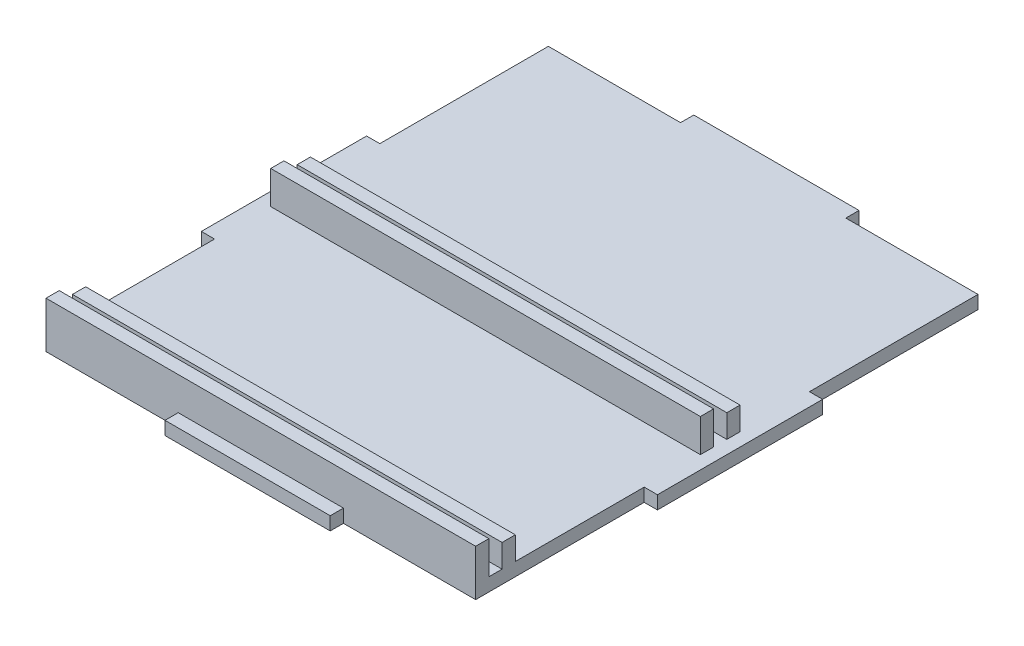
ISO-10303-21;
HEADER;
FILE_DESCRIPTION(('STEP AP214'),'2;1');
FILE_NAME('part.step','',(''),(''),'','','');
FILE_SCHEMA(('AUTOMOTIVE_DESIGN { 1 0 10303 214 1 1 1 1 }'));
ENDSEC;
DATA;
#1=APPLICATION_CONTEXT('core data for automotive mechanical design processes');
#2=APPLICATION_PROTOCOL_DEFINITION('international standard','automotive_design',2000,#1);
#3=PRODUCT_CONTEXT('',#1,'mechanical');
#4=PRODUCT('Part','Part','',(#3));
#5=PRODUCT_RELATED_PRODUCT_CATEGORY('part','',(#4));
#6=PRODUCT_DEFINITION_FORMATION('','',#4);
#7=PRODUCT_DEFINITION_CONTEXT('part definition',#1,'design');
#8=PRODUCT_DEFINITION('design','',#6,#7);
#9=PRODUCT_DEFINITION_SHAPE('','',#8);
#10=(LENGTH_UNIT() NAMED_UNIT(*) SI_UNIT(.MILLI.,.METRE.));
#11=(NAMED_UNIT(*) PLANE_ANGLE_UNIT() SI_UNIT($,.RADIAN.));
#12=(NAMED_UNIT(*) SI_UNIT($,.STERADIAN.) SOLID_ANGLE_UNIT());
#13=UNCERTAINTY_MEASURE_WITH_UNIT(LENGTH_MEASURE(1.E-05),#10,'distance_accuracy_value','');
#14=(GEOMETRIC_REPRESENTATION_CONTEXT(3) GLOBAL_UNCERTAINTY_ASSIGNED_CONTEXT((#13)) GLOBAL_UNIT_ASSIGNED_CONTEXT((#10,
#11,#12)) REPRESENTATION_CONTEXT('',''));
#15=CARTESIAN_POINT('',(0.,0.,0.));
#16=DIRECTION('',(0.,0.,1.));
#17=DIRECTION('',(1.,0.,0.));
#18=AXIS2_PLACEMENT_3D('',#15,#16,#17);
#19=CARTESIAN_POINT('',(0.,4.,0.));
#20=DIRECTION('',(0.,1.,0.));
#21=DIRECTION('',(0.,0.,1.));
#22=AXIS2_PLACEMENT_3D('',#19,#20,#21);
#23=PLANE('',#22);
#24=DIRECTION('',(0.,0.,1.));
#25=VECTOR('',#24,1.);
#26=CARTESIAN_POINT('',(-65.,4.,25.));
#27=LINE('',#26,#25);
#28=CARTESIAN_POINT('',(-65.,4.,25.));
#29=VERTEX_POINT('',#28);
#30=CARTESIAN_POINT('',(-65.,4.,64.));
#31=VERTEX_POINT('',#30);
#32=EDGE_CURVE('E420',#29,#31,#27,.T.);
#33=ORIENTED_EDGE('',*,*,#32,.T.);
#34=DIRECTION('',(-1.,0.,0.));
#35=VECTOR('',#34,1.);
#36=CARTESIAN_POINT('',(-65.,4.,64.));
#37=LINE('',#36,#35);
#38=CARTESIAN_POINT('',(65.,4.,64.));
#39=VERTEX_POINT('',#38);
#40=EDGE_CURVE('E347',#39,#31,#37,.T.);
#41=ORIENTED_EDGE('',*,*,#40,.F.);
#42=DIRECTION('',(0.,0.,-1.));
#43=VECTOR('',#42,1.);
#44=CARTESIAN_POINT('',(65.,4.,25.));
#45=LINE('',#44,#43);
#46=CARTESIAN_POINT('',(65.,4.,25.));
#47=VERTEX_POINT('',#46);
#48=EDGE_CURVE('E432',#39,#47,#45,.T.);
#49=ORIENTED_EDGE('',*,*,#48,.T.);
#50=DIRECTION('',(1.,0.,0.));
#51=VECTOR('',#50,1.);
#52=CARTESIAN_POINT('',(65.,4.,25.));
#53=LINE('',#52,#51);
#54=CARTESIAN_POINT('',(69.,4.,25.));
#55=VERTEX_POINT('',#54);
#56=EDGE_CURVE('E436',#47,#55,#53,.T.);
#57=ORIENTED_EDGE('',*,*,#56,.T.);
#58=DIRECTION('',(0.,0.,-1.));
#59=VECTOR('',#58,1.);
#60=CARTESIAN_POINT('',(69.,4.,25.));
#61=LINE('',#60,#59);
#62=CARTESIAN_POINT('',(69.,4.,-25.));
#63=VERTEX_POINT('',#62);
#64=EDGE_CURVE('E439',#55,#63,#61,.T.);
#65=ORIENTED_EDGE('',*,*,#64,.T.);
#66=DIRECTION('',(-1.,0.,0.));
#67=VECTOR('',#66,1.);
#68=CARTESIAN_POINT('',(65.,4.,-25.));
#69=LINE('',#68,#67);
#70=CARTESIAN_POINT('',(65.,4.,-25.));
#71=VERTEX_POINT('',#70);
#72=EDGE_CURVE('E442',#63,#71,#69,.T.);
#73=ORIENTED_EDGE('',*,*,#72,.T.);
#74=DIRECTION('',(0.,0.,-1.));
#75=VECTOR('',#74,1.);
#76=CARTESIAN_POINT('',(65.,4.,-76.));
#77=LINE('',#76,#75);
#78=CARTESIAN_POINT('',(65.,4.,-76.));
#79=VERTEX_POINT('',#78);
#80=EDGE_CURVE('E445',#71,#79,#77,.T.);
#81=ORIENTED_EDGE('',*,*,#80,.T.);
#82=DIRECTION('',(-1.,0.,0.));
#83=VECTOR('',#82,1.);
#84=CARTESIAN_POINT('',(25.,4.,-76.));
#85=LINE('',#84,#83);
#86=CARTESIAN_POINT('',(25.,4.,-76.));
#87=VERTEX_POINT('',#86);
#88=EDGE_CURVE('E448',#79,#87,#85,.T.);
#89=ORIENTED_EDGE('',*,*,#88,.T.);
#90=DIRECTION('',(0.,0.,-1.));
#91=VECTOR('',#90,1.);
#92=CARTESIAN_POINT('',(25.,4.,-80.));
#93=LINE('',#92,#91);
#94=CARTESIAN_POINT('',(25.,4.,-80.));
#95=VERTEX_POINT('',#94);
#96=EDGE_CURVE('E451',#87,#95,#93,.T.);
#97=ORIENTED_EDGE('',*,*,#96,.T.);
#98=DIRECTION('',(-1.,0.,0.));
#99=VECTOR('',#98,1.);
#100=CARTESIAN_POINT('',(-25.,4.,-80.));
#101=LINE('',#100,#99);
#102=CARTESIAN_POINT('',(-25.,4.,-80.));
#103=VERTEX_POINT('',#102);
#104=EDGE_CURVE('E454',#95,#103,#101,.T.);
#105=ORIENTED_EDGE('',*,*,#104,.T.);
#106=DIRECTION('',(0.,0.,1.));
#107=VECTOR('',#106,1.);
#108=CARTESIAN_POINT('',(-25.,4.,-80.));
#109=LINE('',#108,#107);
#110=CARTESIAN_POINT('',(-25.,4.,-76.));
#111=VERTEX_POINT('',#110);
#112=EDGE_CURVE('E457',#103,#111,#109,.T.);
#113=ORIENTED_EDGE('',*,*,#112,.T.);
#114=DIRECTION('',(-1.,0.,0.));
#115=VECTOR('',#114,1.);
#116=CARTESIAN_POINT('',(-25.,4.,-76.));
#117=LINE('',#116,#115);
#118=CARTESIAN_POINT('',(-65.,4.,-76.));
#119=VERTEX_POINT('',#118);
#120=EDGE_CURVE('E460',#111,#119,#117,.T.);
#121=ORIENTED_EDGE('',*,*,#120,.T.);
#122=DIRECTION('',(0.,0.,1.));
#123=VECTOR('',#122,1.);
#124=CARTESIAN_POINT('',(-65.,4.,-76.));
#125=LINE('',#124,#123);
#126=CARTESIAN_POINT('',(-65.,4.,-25.));
#127=VERTEX_POINT('',#126);
#128=EDGE_CURVE('E405',#119,#127,#125,.T.);
#129=ORIENTED_EDGE('',*,*,#128,.T.);
#130=DIRECTION('',(-1.,0.,0.));
#131=VECTOR('',#130,1.);
#132=CARTESIAN_POINT('',(-69.,4.,-25.));
#133=LINE('',#132,#131);
#134=CARTESIAN_POINT('',(-69.,4.,-25.));
#135=VERTEX_POINT('',#134);
#136=EDGE_CURVE('E409',#127,#135,#133,.T.);
#137=ORIENTED_EDGE('',*,*,#136,.T.);
#138=DIRECTION('',(0.,0.,1.));
#139=VECTOR('',#138,1.);
#140=CARTESIAN_POINT('',(-69.,4.,-25.));
#141=LINE('',#140,#139);
#142=CARTESIAN_POINT('',(-69.,4.,25.));
#143=VERTEX_POINT('',#142);
#144=EDGE_CURVE('E413',#135,#143,#141,.T.);
#145=ORIENTED_EDGE('',*,*,#144,.T.);
#146=DIRECTION('',(1.,0.,0.));
#147=VECTOR('',#146,1.);
#148=CARTESIAN_POINT('',(-69.,4.,25.));
#149=LINE('',#148,#147);
#150=EDGE_CURVE('E416',#143,#29,#149,.T.);
#151=ORIENTED_EDGE('',*,*,#150,.T.);
#152=EDGE_LOOP('',(#33,#41,#49,#57,#65,#73,#81,#89,#97,#105,#113,#121,#129,#137,#145,#151));
#153=FACE_BOUND('',#152,.T.);
#154=DIRECTION('',(0.,0.,1.));
#155=VECTOR('',#154,1.);
#156=CARTESIAN_POINT('',(-65.,4.,4.00000000000001));
#157=LINE('',#156,#155);
#158=CARTESIAN_POINT('',(-65.,4.,4.00000000000001));
#159=VERTEX_POINT('',#158);
#160=CARTESIAN_POINT('',(-65.,4.,7.99999999999999));
#161=VERTEX_POINT('',#160);
#162=EDGE_CURVE('E302',#159,#161,#157,.T.);
#163=ORIENTED_EDGE('',*,*,#162,.F.);
#164=DIRECTION('',(-1.,0.,0.));
#165=VECTOR('',#164,1.);
#166=CARTESIAN_POINT('',(65.,4.,3.99999999999999));
#167=LINE('',#166,#165);
#168=CARTESIAN_POINT('',(65.,4.,3.99999999999999));
#169=VERTEX_POINT('',#168);
#170=EDGE_CURVE('E297',#169,#159,#167,.T.);
#171=ORIENTED_EDGE('',*,*,#170,.F.);
#172=DIRECTION('',(0.,0.,-1.));
#173=VECTOR('',#172,1.);
#174=CARTESIAN_POINT('',(65.,4.,7.99999999999999));
#175=LINE('',#174,#173);
#176=CARTESIAN_POINT('',(65.,4.,7.99999999999999));
#177=VERTEX_POINT('',#176);
#178=EDGE_CURVE('E312',#177,#169,#175,.T.);
#179=ORIENTED_EDGE('',*,*,#178,.F.);
#180=DIRECTION('',(1.,0.,0.));
#181=VECTOR('',#180,1.);
#182=CARTESIAN_POINT('',(-65.,4.,7.99999999999999));
#183=LINE('',#182,#181);
#184=EDGE_CURVE('E324',#161,#177,#183,.T.);
#185=ORIENTED_EDGE('',*,*,#184,.F.);
#186=EDGE_LOOP('',(#163,#171,#179,#185));
#187=FACE_BOUND('',#186,.T.);
#188=DIRECTION('',(0.,0.,1.));
#189=VECTOR('',#188,1.);
#190=CARTESIAN_POINT('',(-65.,4.,-3.99999999999999));
#191=LINE('',#190,#189);
#192=CARTESIAN_POINT('',(-65.,4.,-3.99999999999999));
#193=VERTEX_POINT('',#192);
#194=CARTESIAN_POINT('',(-65.,4.,0.));
#195=VERTEX_POINT('',#194);
#196=EDGE_CURVE('E1063',#193,#195,#191,.T.);
#197=ORIENTED_EDGE('',*,*,#196,.F.);
#198=DIRECTION('',(-1.,0.,0.));
#199=VECTOR('',#198,1.);
#200=CARTESIAN_POINT('',(65.,4.,-4.00000000000001));
#201=LINE('',#200,#199);
#202=CARTESIAN_POINT('',(65.,4.,-4.00000000000001));
#203=VERTEX_POINT('',#202);
#204=EDGE_CURVE('E294',#203,#193,#201,.T.);
#205=ORIENTED_EDGE('',*,*,#204,.F.);
#206=DIRECTION('',(0.,0.,-1.));
#207=VECTOR('',#206,1.);
#208=CARTESIAN_POINT('',(65.,4.,0.));
#209=LINE('',#208,#207);
#210=CARTESIAN_POINT('',(65.,4.,0.));
#211=VERTEX_POINT('',#210);
#212=EDGE_CURVE('E290',#211,#203,#209,.T.);
#213=ORIENTED_EDGE('',*,*,#212,.F.);
#214=DIRECTION('',(1.,0.,0.));
#215=VECTOR('',#214,1.);
#216=CARTESIAN_POINT('',(-65.,4.,0.));
#217=LINE('',#216,#215);
#218=EDGE_CURVE('E1059',#195,#211,#217,.T.);
#219=ORIENTED_EDGE('',*,*,#218,.F.);
#220=EDGE_LOOP('',(#197,#205,#213,#219));
#221=FACE_BOUND('',#220,.T.);
#222=ADVANCED_FACE('F45',(#153,#187,#221),#23,.T.);
#223=CARTESIAN_POINT('',(65.,4.,72.));
#224=VERTEX_POINT('',#223);
#225=CARTESIAN_POINT('',(65.,4.,68.));
#226=VERTEX_POINT('',#225);
#227=EDGE_CURVE('E433',#224,#226,#45,.T.);
#228=ORIENTED_EDGE('',*,*,#227,.T.);
#229=DIRECTION('',(1.,0.,0.));
#230=VECTOR('',#229,1.);
#231=CARTESIAN_POINT('',(65.,4.,68.));
#232=LINE('',#231,#230);
#233=CARTESIAN_POINT('',(-65.,4.,68.));
#234=VERTEX_POINT('',#233);
#235=EDGE_CURVE('E341',#234,#226,#232,.T.);
#236=ORIENTED_EDGE('',*,*,#235,.F.);
#237=CARTESIAN_POINT('',(-65.,4.,72.));
#238=VERTEX_POINT('',#237);
#239=EDGE_CURVE('E419',#234,#238,#27,.T.);
#240=ORIENTED_EDGE('',*,*,#239,.T.);
#241=DIRECTION('',(-1.,0.,0.));
#242=VECTOR('',#241,1.);
#243=CARTESIAN_POINT('',(-65.,4.,72.));
#244=LINE('',#243,#242);
#245=EDGE_CURVE('E378',#224,#238,#244,.T.);
#246=ORIENTED_EDGE('',*,*,#245,.F.);
#247=EDGE_LOOP('',(#228,#236,#240,#246));
#248=FACE_BOUND('',#247,.T.);
#249=ADVANCED_FACE('F715',(#248),#23,.T.);
#250=CARTESIAN_POINT('',(-65.,4.,-76.));
#251=DIRECTION('',(1.,0.,0.));
#252=DIRECTION('',(0.,0.,-1.));
#253=AXIS2_PLACEMENT_3D('',#250,#251,#252);
#254=PLANE('',#253);
#255=DIRECTION('',(0.,0.,1.));
#256=VECTOR('',#255,1.);
#257=CARTESIAN_POINT('',(-65.,0.,-76.));
#258=LINE('',#257,#256);
#259=CARTESIAN_POINT('',(-65.,0.,-76.));
#260=VERTEX_POINT('',#259);
#261=CARTESIAN_POINT('',(-65.,0.,-25.));
#262=VERTEX_POINT('',#261);
#263=EDGE_CURVE('E404',#260,#262,#258,.T.);
#264=ORIENTED_EDGE('',*,*,#263,.T.);
#265=DIRECTION('',(0.,-1.,0.));
#266=VECTOR('',#265,1.);
#267=CARTESIAN_POINT('',(-65.,4.,-25.));
#268=LINE('',#267,#266);
#269=EDGE_CURVE('E49',#127,#262,#268,.T.);
#270=ORIENTED_EDGE('',*,*,#269,.F.);
#271=ORIENTED_EDGE('',*,*,#128,.F.);
#272=DIRECTION('',(0.,-1.,0.));
#273=VECTOR('',#272,1.);
#274=CARTESIAN_POINT('',(-65.,4.,-76.));
#275=LINE('',#274,#273);
#276=EDGE_CURVE('E463',#119,#260,#275,.T.);
#277=ORIENTED_EDGE('',*,*,#276,.T.);
#278=EDGE_LOOP('',(#264,#270,#271,#277));
#279=FACE_BOUND('',#278,.T.);
#280=ADVANCED_FACE('F47',(#279),#254,.F.);
#281=CARTESIAN_POINT('',(-69.,4.,-25.));
#282=DIRECTION('',(0.,0.,1.));
#283=DIRECTION('',(1.,0.,0.));
#284=AXIS2_PLACEMENT_3D('',#281,#282,#283);
#285=PLANE('',#284);
#286=DIRECTION('',(-1.,0.,0.));
#287=VECTOR('',#286,1.);
#288=CARTESIAN_POINT('',(-69.,0.,-25.));
#289=LINE('',#288,#287);
#290=CARTESIAN_POINT('',(-69.,0.,-25.));
#291=VERTEX_POINT('',#290);
#292=EDGE_CURVE('E467',#262,#291,#289,.T.);
#293=ORIENTED_EDGE('',*,*,#292,.T.);
#294=DIRECTION('',(0.,-1.,0.));
#295=VECTOR('',#294,1.);
#296=CARTESIAN_POINT('',(-69.,4.,-25.));
#297=LINE('',#296,#295);
#298=EDGE_CURVE('E593',#135,#291,#297,.T.);
#299=ORIENTED_EDGE('',*,*,#298,.F.);
#300=ORIENTED_EDGE('',*,*,#136,.F.);
#301=ORIENTED_EDGE('',*,*,#269,.T.);
#302=EDGE_LOOP('',(#293,#299,#300,#301));
#303=FACE_BOUND('',#302,.T.);
#304=ADVANCED_FACE('F604',(#303),#285,.F.);
#305=CARTESIAN_POINT('',(-69.,4.,-25.));
#306=DIRECTION('',(1.,0.,0.));
#307=DIRECTION('',(0.,0.,-1.));
#308=AXIS2_PLACEMENT_3D('',#305,#306,#307);
#309=PLANE('',#308);
#310=DIRECTION('',(0.,0.,1.));
#311=VECTOR('',#310,1.);
#312=CARTESIAN_POINT('',(-69.,0.,-25.));
#313=LINE('',#312,#311);
#314=CARTESIAN_POINT('',(-69.,0.,25.));
#315=VERTEX_POINT('',#314);
#316=EDGE_CURVE('E470',#291,#315,#313,.T.);
#317=ORIENTED_EDGE('',*,*,#316,.T.);
#318=DIRECTION('',(0.,-1.,0.));
#319=VECTOR('',#318,1.);
#320=CARTESIAN_POINT('',(-69.,4.,25.));
#321=LINE('',#320,#319);
#322=EDGE_CURVE('E590',#143,#315,#321,.T.);
#323=ORIENTED_EDGE('',*,*,#322,.F.);
#324=ORIENTED_EDGE('',*,*,#144,.F.);
#325=ORIENTED_EDGE('',*,*,#298,.T.);
#326=EDGE_LOOP('',(#317,#323,#324,#325));
#327=FACE_BOUND('',#326,.T.);
#328=ADVANCED_FACE('F616',(#327),#309,.F.);
#329=CARTESIAN_POINT('',(-69.,4.,25.));
#330=DIRECTION('',(0.,0.,-1.));
#331=DIRECTION('',(-1.,0.,0.));
#332=AXIS2_PLACEMENT_3D('',#329,#330,#331);
#333=PLANE('',#332);
#334=DIRECTION('',(1.,0.,0.));
#335=VECTOR('',#334,1.);
#336=CARTESIAN_POINT('',(-69.,0.,25.));
#337=LINE('',#336,#335);
#338=CARTESIAN_POINT('',(-65.,0.,25.));
#339=VERTEX_POINT('',#338);
#340=EDGE_CURVE('E473',#315,#339,#337,.T.);
#341=ORIENTED_EDGE('',*,*,#340,.T.);
#342=DIRECTION('',(0.,-1.,0.));
#343=VECTOR('',#342,1.);
#344=CARTESIAN_POINT('',(-65.,4.,25.));
#345=LINE('',#344,#343);
#346=EDGE_CURVE('E586',#29,#339,#345,.T.);
#347=ORIENTED_EDGE('',*,*,#346,.F.);
#348=ORIENTED_EDGE('',*,*,#150,.F.);
#349=ORIENTED_EDGE('',*,*,#322,.T.);
#350=EDGE_LOOP('',(#341,#347,#348,#349));
#351=FACE_BOUND('',#350,.T.);
#352=ADVANCED_FACE('F619',(#351),#333,.F.);
#353=CARTESIAN_POINT('',(-65.,4.,25.));
#354=DIRECTION('',(1.,0.,0.));
#355=DIRECTION('',(0.,0.,-1.));
#356=AXIS2_PLACEMENT_3D('',#353,#354,#355);
#357=PLANE('',#356);
#358=DIRECTION('',(0.,0.,1.));
#359=VECTOR('',#358,1.);
#360=CARTESIAN_POINT('',(-65.,0.,25.));
#361=LINE('',#360,#359);
#362=CARTESIAN_POINT('',(-65.,0.,76.));
#363=VERTEX_POINT('',#362);
#364=EDGE_CURVE('E476',#339,#363,#361,.T.);
#365=ORIENTED_EDGE('',*,*,#364,.T.);
#366=DIRECTION('',(0.,-1.,0.));
#367=VECTOR('',#366,1.);
#368=CARTESIAN_POINT('',(-65.,4.,76.));
#369=LINE('',#368,#367);
#370=CARTESIAN_POINT('',(-65.,14.,76.));
#371=VERTEX_POINT('',#370);
#372=EDGE_CURVE('E582',#371,#363,#369,.T.);
#373=ORIENTED_EDGE('',*,*,#372,.F.);
#374=DIRECTION('',(0.,0.,1.));
#375=VECTOR('',#374,1.);
#376=CARTESIAN_POINT('',(-65.,14.,76.));
#377=LINE('',#376,#375);
#378=CARTESIAN_POINT('',(-65.,14.,72.));
#379=VERTEX_POINT('',#378);
#380=EDGE_CURVE('E379',#379,#371,#377,.T.);
#381=ORIENTED_EDGE('',*,*,#380,.F.);
#382=DIRECTION('',(0.,-1.,0.));
#383=VECTOR('',#382,1.);
#384=CARTESIAN_POINT('',(-65.,14.,72.));
#385=LINE('',#384,#383);
#386=EDGE_CURVE('E392',#379,#238,#385,.T.);
#387=ORIENTED_EDGE('',*,*,#386,.T.);
#388=ORIENTED_EDGE('',*,*,#239,.F.);
#389=DIRECTION('',(0.,-1.,0.));
#390=VECTOR('',#389,1.);
#391=CARTESIAN_POINT('',(-65.,11.,68.));
#392=LINE('',#391,#390);
#393=CARTESIAN_POINT('',(-65.,11.,68.));
#394=VERTEX_POINT('',#393);
#395=EDGE_CURVE('E356',#394,#234,#392,.T.);
#396=ORIENTED_EDGE('',*,*,#395,.F.);
#397=DIRECTION('',(0.,0.,1.));
#398=VECTOR('',#397,1.);
#399=CARTESIAN_POINT('',(-65.,11.,68.));
#400=LINE('',#399,#398);
#401=CARTESIAN_POINT('',(-65.,11.,64.));
#402=VERTEX_POINT('',#401);
#403=EDGE_CURVE('E353',#402,#394,#400,.T.);
#404=ORIENTED_EDGE('',*,*,#403,.F.);
#405=DIRECTION('',(0.,-1.,0.));
#406=VECTOR('',#405,1.);
#407=CARTESIAN_POINT('',(-65.,11.,64.));
#408=LINE('',#407,#406);
#409=EDGE_CURVE('E366',#402,#31,#408,.T.);
#410=ORIENTED_EDGE('',*,*,#409,.T.);
#411=ORIENTED_EDGE('',*,*,#32,.F.);
#412=ORIENTED_EDGE('',*,*,#346,.T.);
#413=EDGE_LOOP('',(#365,#373,#381,#387,#388,#396,#404,#410,#411,#412));
#414=FACE_BOUND('',#413,.T.);
#415=ADVANCED_FACE('F684',(#414),#357,.F.);
#416=CARTESIAN_POINT('',(-25.,4.,80.));
#417=DIRECTION('',(1.,0.,0.));
#418=DIRECTION('',(0.,0.,-1.));
#419=AXIS2_PLACEMENT_3D('',#416,#417,#418);
#420=PLANE('',#419);
#421=DIRECTION('',(0.,0.,1.));
#422=VECTOR('',#421,1.);
#423=CARTESIAN_POINT('',(-25.,0.,80.));
#424=LINE('',#423,#422);
#425=CARTESIAN_POINT('',(-25.,0.,76.));
#426=VERTEX_POINT('',#425);
#427=CARTESIAN_POINT('',(-25.,0.,80.));
#428=VERTEX_POINT('',#427);
#429=EDGE_CURVE('E482',#426,#428,#424,.T.);
#430=ORIENTED_EDGE('',*,*,#429,.T.);
#431=DIRECTION('',(0.,-1.,0.));
#432=VECTOR('',#431,1.);
#433=CARTESIAN_POINT('',(-25.,4.,80.));
#434=LINE('',#433,#432);
#435=CARTESIAN_POINT('',(-25.,4.,80.));
#436=VERTEX_POINT('',#435);
#437=EDGE_CURVE('E574',#436,#428,#434,.T.);
#438=ORIENTED_EDGE('',*,*,#437,.F.);
#439=DIRECTION('',(0.,0.,1.));
#440=VECTOR('',#439,1.);
#441=CARTESIAN_POINT('',(-25.,4.,80.));
#442=LINE('',#441,#440);
#443=CARTESIAN_POINT('',(-25.,4.,76.));
#444=VERTEX_POINT('',#443);
#445=EDGE_CURVE('E423',#444,#436,#442,.T.);
#446=ORIENTED_EDGE('',*,*,#445,.F.);
#447=DIRECTION('',(0.,-1.,0.));
#448=VECTOR('',#447,1.);
#449=CARTESIAN_POINT('',(-25.,4.,76.));
#450=LINE('',#449,#448);
#451=EDGE_CURVE('E578',#444,#426,#450,.T.);
#452=ORIENTED_EDGE('',*,*,#451,.T.);
#453=EDGE_LOOP('',(#430,#438,#446,#452));
#454=FACE_BOUND('',#453,.T.);
#455=ADVANCED_FACE('F693',(#454),#420,.F.);
#456=CARTESIAN_POINT('',(-25.,4.,80.));
#457=DIRECTION('',(0.,0.,-1.));
#458=DIRECTION('',(-1.,0.,0.));
#459=AXIS2_PLACEMENT_3D('',#456,#457,#458);
#460=PLANE('',#459);
#461=DIRECTION('',(1.,0.,0.));
#462=VECTOR('',#461,1.);
#463=CARTESIAN_POINT('',(-25.,0.,80.));
#464=LINE('',#463,#462);
#465=CARTESIAN_POINT('',(25.,0.,80.));
#466=VERTEX_POINT('',#465);
#467=EDGE_CURVE('E485',#428,#466,#464,.T.);
#468=ORIENTED_EDGE('',*,*,#467,.T.);
#469=DIRECTION('',(0.,-1.,0.));
#470=VECTOR('',#469,1.);
#471=CARTESIAN_POINT('',(25.,4.,80.));
#472=LINE('',#471,#470);
#473=CARTESIAN_POINT('',(25.,4.,80.));
#474=VERTEX_POINT('',#473);
#475=EDGE_CURVE('E570',#474,#466,#472,.T.);
#476=ORIENTED_EDGE('',*,*,#475,.F.);
#477=DIRECTION('',(1.,0.,0.));
#478=VECTOR('',#477,1.);
#479=CARTESIAN_POINT('',(-25.,4.,80.));
#480=LINE('',#479,#478);
#481=EDGE_CURVE('E426',#436,#474,#480,.T.);
#482=ORIENTED_EDGE('',*,*,#481,.F.);
#483=ORIENTED_EDGE('',*,*,#437,.T.);
#484=EDGE_LOOP('',(#468,#476,#482,#483));
#485=FACE_BOUND('',#484,.T.);
#486=ADVANCED_FACE('F697',(#485),#460,.F.);
#487=CARTESIAN_POINT('',(25.,4.,80.));
#488=DIRECTION('',(-1.,0.,0.));
#489=DIRECTION('',(0.,0.,1.));
#490=AXIS2_PLACEMENT_3D('',#487,#488,#489);
#491=PLANE('',#490);
#492=DIRECTION('',(0.,0.,-1.));
#493=VECTOR('',#492,1.);
#494=CARTESIAN_POINT('',(25.,0.,80.));
#495=LINE('',#494,#493);
#496=CARTESIAN_POINT('',(25.,0.,76.));
#497=VERTEX_POINT('',#496);
#498=EDGE_CURVE('E488',#466,#497,#495,.T.);
#499=ORIENTED_EDGE('',*,*,#498,.T.);
#500=DIRECTION('',(0.,-1.,0.));
#501=VECTOR('',#500,1.);
#502=CARTESIAN_POINT('',(25.,4.,76.));
#503=LINE('',#502,#501);
#504=CARTESIAN_POINT('',(25.,4.,76.));
#505=VERTEX_POINT('',#504);
#506=EDGE_CURVE('E566',#505,#497,#503,.T.);
#507=ORIENTED_EDGE('',*,*,#506,.F.);
#508=DIRECTION('',(0.,0.,-1.));
#509=VECTOR('',#508,1.);
#510=CARTESIAN_POINT('',(25.,4.,80.));
#511=LINE('',#510,#509);
#512=EDGE_CURVE('E429',#474,#505,#511,.T.);
#513=ORIENTED_EDGE('',*,*,#512,.F.);
#514=ORIENTED_EDGE('',*,*,#475,.T.);
#515=EDGE_LOOP('',(#499,#507,#513,#514));
#516=FACE_BOUND('',#515,.T.);
#517=ADVANCED_FACE('F704',(#516),#491,.F.);
#518=CARTESIAN_POINT('',(25.,4.,76.));
#519=DIRECTION('',(0.,0.,-1.));
#520=DIRECTION('',(-1.,0.,0.));
#521=AXIS2_PLACEMENT_3D('',#518,#519,#520);
#522=PLANE('',#521);
#523=DIRECTION('',(1.,0.,0.));
#524=VECTOR('',#523,1.);
#525=CARTESIAN_POINT('',(25.,0.,76.));
#526=LINE('',#525,#524);
#527=CARTESIAN_POINT('',(65.,0.,76.));
#528=VERTEX_POINT('',#527);
#529=EDGE_CURVE('E491',#497,#528,#526,.T.);
#530=ORIENTED_EDGE('',*,*,#529,.T.);
#531=DIRECTION('',(0.,-1.,0.));
#532=VECTOR('',#531,1.);
#533=CARTESIAN_POINT('',(65.,4.,76.));
#534=LINE('',#533,#532);
#535=CARTESIAN_POINT('',(65.,14.,76.));
#536=VERTEX_POINT('',#535);
#537=EDGE_CURVE('E562',#536,#528,#534,.T.);
#538=ORIENTED_EDGE('',*,*,#537,.F.);
#539=DIRECTION('',(1.,0.,0.));
#540=VECTOR('',#539,1.);
#541=CARTESIAN_POINT('',(-65.,14.,76.));
#542=LINE('',#541,#540);
#543=EDGE_CURVE('E383',#371,#536,#542,.T.);
#544=ORIENTED_EDGE('',*,*,#543,.F.);
#545=ORIENTED_EDGE('',*,*,#372,.T.);
#546=DIRECTION('',(1.,0.,0.));
#547=VECTOR('',#546,1.);
#548=CARTESIAN_POINT('',(-25.,0.,76.));
#549=LINE('',#548,#547);
#550=EDGE_CURVE('E479',#363,#426,#549,.T.);
#551=ORIENTED_EDGE('',*,*,#550,.T.);
#552=ORIENTED_EDGE('',*,*,#451,.F.);
#553=DIRECTION('',(1.,0.,0.));
#554=VECTOR('',#553,1.);
#555=CARTESIAN_POINT('',(-65.,4.,76.));
#556=LINE('',#555,#554);
#557=EDGE_CURVE('E11',#444,#505,#556,.T.);
#558=ORIENTED_EDGE('',*,*,#557,.T.);
#559=ORIENTED_EDGE('',*,*,#506,.T.);
#560=EDGE_LOOP('',(#530,#538,#544,#545,#551,#552,#558,#559));
#561=FACE_BOUND('',#560,.T.);
#562=ADVANCED_FACE('F677',(#561),#522,.F.);
#563=CARTESIAN_POINT('',(65.,4.,25.));
#564=DIRECTION('',(-1.,0.,0.));
#565=DIRECTION('',(0.,0.,1.));
#566=AXIS2_PLACEMENT_3D('',#563,#564,#565);
#567=PLANE('',#566);
#568=DIRECTION('',(0.,0.,-1.));
#569=VECTOR('',#568,1.);
#570=CARTESIAN_POINT('',(65.,0.,25.));
#571=LINE('',#570,#569);
#572=CARTESIAN_POINT('',(65.,0.,25.));
#573=VERTEX_POINT('',#572);
#574=EDGE_CURVE('E494',#528,#573,#571,.T.);
#575=ORIENTED_EDGE('',*,*,#574,.T.);
#576=DIRECTION('',(0.,-1.,0.));
#577=VECTOR('',#576,1.);
#578=CARTESIAN_POINT('',(65.,4.,25.));
#579=LINE('',#578,#577);
#580=EDGE_CURVE('E558',#47,#573,#579,.T.);
#581=ORIENTED_EDGE('',*,*,#580,.F.);
#582=ORIENTED_EDGE('',*,*,#48,.F.);
#583=DIRECTION('',(0.,-1.,0.));
#584=VECTOR('',#583,1.);
#585=CARTESIAN_POINT('',(65.,11.,64.));
#586=LINE('',#585,#584);
#587=CARTESIAN_POINT('',(65.,11.,64.));
#588=VERTEX_POINT('',#587);
#589=EDGE_CURVE('E370',#588,#39,#586,.T.);
#590=ORIENTED_EDGE('',*,*,#589,.F.);
#591=DIRECTION('',(0.,0.,-1.));
#592=VECTOR('',#591,1.);
#593=CARTESIAN_POINT('',(65.,11.,64.));
#594=LINE('',#593,#592);
#595=CARTESIAN_POINT('',(65.,11.,68.));
#596=VERTEX_POINT('',#595);
#597=EDGE_CURVE('E346',#596,#588,#594,.T.);
#598=ORIENTED_EDGE('',*,*,#597,.F.);
#599=DIRECTION('',(0.,-1.,0.));
#600=VECTOR('',#599,1.);
#601=CARTESIAN_POINT('',(65.,11.,68.));
#602=LINE('',#601,#600);
#603=EDGE_CURVE('E374',#596,#226,#602,.T.);
#604=ORIENTED_EDGE('',*,*,#603,.T.);
#605=ORIENTED_EDGE('',*,*,#227,.F.);
#606=DIRECTION('',(0.,-1.,0.));
#607=VECTOR('',#606,1.);
#608=CARTESIAN_POINT('',(65.,14.,72.));
#609=LINE('',#608,#607);
#610=CARTESIAN_POINT('',(65.,14.,72.));
#611=VERTEX_POINT('',#610);
#612=EDGE_CURVE('E400',#611,#224,#609,.T.);
#613=ORIENTED_EDGE('',*,*,#612,.F.);
#614=DIRECTION('',(0.,0.,-1.));
#615=VECTOR('',#614,1.);
#616=CARTESIAN_POINT('',(65.,14.,72.));
#617=LINE('',#616,#615);
#618=EDGE_CURVE('E387',#536,#611,#617,.T.);
#619=ORIENTED_EDGE('',*,*,#618,.F.);
#620=ORIENTED_EDGE('',*,*,#537,.T.);
#621=EDGE_LOOP('',(#575,#581,#582,#590,#598,#604,#605,#613,#619,#620));
#622=FACE_BOUND('',#621,.T.);
#623=ADVANCED_FACE('F671',(#622),#567,.F.);
#624=CARTESIAN_POINT('',(65.,4.,25.));
#625=DIRECTION('',(0.,0.,-1.));
#626=DIRECTION('',(-1.,0.,0.));
#627=AXIS2_PLACEMENT_3D('',#624,#625,#626);
#628=PLANE('',#627);
#629=DIRECTION('',(1.,0.,0.));
#630=VECTOR('',#629,1.);
#631=CARTESIAN_POINT('',(65.,0.,25.));
#632=LINE('',#631,#630);
#633=CARTESIAN_POINT('',(69.,0.,25.));
#634=VERTEX_POINT('',#633);
#635=EDGE_CURVE('E497',#573,#634,#632,.T.);
#636=ORIENTED_EDGE('',*,*,#635,.T.);
#637=DIRECTION('',(0.,-1.,0.));
#638=VECTOR('',#637,1.);
#639=CARTESIAN_POINT('',(69.,4.,25.));
#640=LINE('',#639,#638);
#641=EDGE_CURVE('E554',#55,#634,#640,.T.);
#642=ORIENTED_EDGE('',*,*,#641,.F.);
#643=ORIENTED_EDGE('',*,*,#56,.F.);
#644=ORIENTED_EDGE('',*,*,#580,.T.);
#645=EDGE_LOOP('',(#636,#642,#643,#644));
#646=FACE_BOUND('',#645,.T.);
#647=ADVANCED_FACE('F667',(#646),#628,.F.);
#648=CARTESIAN_POINT('',(69.,4.,25.));
#649=DIRECTION('',(-1.,0.,0.));
#650=DIRECTION('',(0.,0.,1.));
#651=AXIS2_PLACEMENT_3D('',#648,#649,#650);
#652=PLANE('',#651);
#653=DIRECTION('',(0.,0.,-1.));
#654=VECTOR('',#653,1.);
#655=CARTESIAN_POINT('',(69.,0.,25.));
#656=LINE('',#655,#654);
#657=CARTESIAN_POINT('',(69.,0.,-25.));
#658=VERTEX_POINT('',#657);
#659=EDGE_CURVE('E500',#634,#658,#656,.T.);
#660=ORIENTED_EDGE('',*,*,#659,.T.);
#661=DIRECTION('',(0.,-1.,0.));
#662=VECTOR('',#661,1.);
#663=CARTESIAN_POINT('',(69.,4.,-25.));
#664=LINE('',#663,#662);
#665=EDGE_CURVE('E550',#63,#658,#664,.T.);
#666=ORIENTED_EDGE('',*,*,#665,.F.);
#667=ORIENTED_EDGE('',*,*,#64,.F.);
#668=ORIENTED_EDGE('',*,*,#641,.T.);
#669=EDGE_LOOP('',(#660,#666,#667,#668));
#670=FACE_BOUND('',#669,.T.);
#671=ADVANCED_FACE('F661',(#670),#652,.F.);
#672=CARTESIAN_POINT('',(65.,4.,-25.));
#673=DIRECTION('',(0.,0.,1.));
#674=DIRECTION('',(1.,0.,0.));
#675=AXIS2_PLACEMENT_3D('',#672,#673,#674);
#676=PLANE('',#675);
#677=DIRECTION('',(-1.,0.,0.));
#678=VECTOR('',#677,1.);
#679=CARTESIAN_POINT('',(65.,0.,-25.));
#680=LINE('',#679,#678);
#681=CARTESIAN_POINT('',(65.,0.,-25.));
#682=VERTEX_POINT('',#681);
#683=EDGE_CURVE('E503',#658,#682,#680,.T.);
#684=ORIENTED_EDGE('',*,*,#683,.T.);
#685=DIRECTION('',(0.,-1.,0.));
#686=VECTOR('',#685,1.);
#687=CARTESIAN_POINT('',(65.,4.,-25.));
#688=LINE('',#687,#686);
#689=EDGE_CURVE('E546',#71,#682,#688,.T.);
#690=ORIENTED_EDGE('',*,*,#689,.F.);
#691=ORIENTED_EDGE('',*,*,#72,.F.);
#692=ORIENTED_EDGE('',*,*,#665,.T.);
#693=EDGE_LOOP('',(#684,#690,#691,#692));
#694=FACE_BOUND('',#693,.T.);
#695=ADVANCED_FACE('F657',(#694),#676,.F.);
#696=CARTESIAN_POINT('',(65.,4.,-76.));
#697=DIRECTION('',(-1.,0.,0.));
#698=DIRECTION('',(0.,0.,1.));
#699=AXIS2_PLACEMENT_3D('',#696,#697,#698);
#700=PLANE('',#699);
#701=DIRECTION('',(0.,0.,-1.));
#702=VECTOR('',#701,1.);
#703=CARTESIAN_POINT('',(65.,0.,-76.));
#704=LINE('',#703,#702);
#705=CARTESIAN_POINT('',(65.,0.,-76.));
#706=VERTEX_POINT('',#705);
#707=EDGE_CURVE('E506',#682,#706,#704,.T.);
#708=ORIENTED_EDGE('',*,*,#707,.T.);
#709=DIRECTION('',(0.,-1.,0.));
#710=VECTOR('',#709,1.);
#711=CARTESIAN_POINT('',(65.,4.,-76.));
#712=LINE('',#711,#710);
#713=EDGE_CURVE('E542',#79,#706,#712,.T.);
#714=ORIENTED_EDGE('',*,*,#713,.F.);
#715=ORIENTED_EDGE('',*,*,#80,.F.);
#716=ORIENTED_EDGE('',*,*,#689,.T.);
#717=EDGE_LOOP('',(#708,#714,#715,#716));
#718=FACE_BOUND('',#717,.T.);
#719=ADVANCED_FACE('F652',(#718),#700,.F.);
#720=CARTESIAN_POINT('',(25.,4.,-76.));
#721=DIRECTION('',(0.,0.,1.));
#722=DIRECTION('',(1.,0.,0.));
#723=AXIS2_PLACEMENT_3D('',#720,#721,#722);
#724=PLANE('',#723);
#725=DIRECTION('',(-1.,0.,0.));
#726=VECTOR('',#725,1.);
#727=CARTESIAN_POINT('',(25.,0.,-76.));
#728=LINE('',#727,#726);
#729=CARTESIAN_POINT('',(25.,0.,-76.));
#730=VERTEX_POINT('',#729);
#731=EDGE_CURVE('E509',#706,#730,#728,.T.);
#732=ORIENTED_EDGE('',*,*,#731,.T.);
#733=DIRECTION('',(0.,-1.,0.));
#734=VECTOR('',#733,1.);
#735=CARTESIAN_POINT('',(25.,4.,-76.));
#736=LINE('',#735,#734);
#737=EDGE_CURVE('E538',#87,#730,#736,.T.);
#738=ORIENTED_EDGE('',*,*,#737,.F.);
#739=ORIENTED_EDGE('',*,*,#88,.F.);
#740=ORIENTED_EDGE('',*,*,#713,.T.);
#741=EDGE_LOOP('',(#732,#738,#739,#740));
#742=FACE_BOUND('',#741,.T.);
#743=ADVANCED_FACE('F646',(#742),#724,.F.);
#744=CARTESIAN_POINT('',(25.,4.,-80.));
#745=DIRECTION('',(-1.,0.,0.));
#746=DIRECTION('',(0.,0.,1.));
#747=AXIS2_PLACEMENT_3D('',#744,#745,#746);
#748=PLANE('',#747);
#749=DIRECTION('',(0.,0.,-1.));
#750=VECTOR('',#749,1.);
#751=CARTESIAN_POINT('',(25.,0.,-80.));
#752=LINE('',#751,#750);
#753=CARTESIAN_POINT('',(25.,0.,-80.));
#754=VERTEX_POINT('',#753);
#755=EDGE_CURVE('E512',#730,#754,#752,.T.);
#756=ORIENTED_EDGE('',*,*,#755,.T.);
#757=DIRECTION('',(0.,-1.,0.));
#758=VECTOR('',#757,1.);
#759=CARTESIAN_POINT('',(25.,4.,-80.));
#760=LINE('',#759,#758);
#761=EDGE_CURVE('E534',#95,#754,#760,.T.);
#762=ORIENTED_EDGE('',*,*,#761,.F.);
#763=ORIENTED_EDGE('',*,*,#96,.F.);
#764=ORIENTED_EDGE('',*,*,#737,.T.);
#765=EDGE_LOOP('',(#756,#762,#763,#764));
#766=FACE_BOUND('',#765,.T.);
#767=ADVANCED_FACE('F642',(#766),#748,.F.);
#768=CARTESIAN_POINT('',(-25.,4.,-80.));
#769=DIRECTION('',(0.,0.,1.));
#770=DIRECTION('',(1.,0.,0.));
#771=AXIS2_PLACEMENT_3D('',#768,#769,#770);
#772=PLANE('',#771);
#773=DIRECTION('',(-1.,0.,0.));
#774=VECTOR('',#773,1.);
#775=CARTESIAN_POINT('',(-25.,0.,-80.));
#776=LINE('',#775,#774);
#777=CARTESIAN_POINT('',(-25.,0.,-80.));
#778=VERTEX_POINT('',#777);
#779=EDGE_CURVE('E515',#754,#778,#776,.T.);
#780=ORIENTED_EDGE('',*,*,#779,.T.);
#781=DIRECTION('',(0.,-1.,0.));
#782=VECTOR('',#781,1.);
#783=CARTESIAN_POINT('',(-25.,4.,-80.));
#784=LINE('',#783,#782);
#785=EDGE_CURVE('E530',#103,#778,#784,.T.);
#786=ORIENTED_EDGE('',*,*,#785,.F.);
#787=ORIENTED_EDGE('',*,*,#104,.F.);
#788=ORIENTED_EDGE('',*,*,#761,.T.);
#789=EDGE_LOOP('',(#780,#786,#787,#788));
#790=FACE_BOUND('',#789,.T.);
#791=ADVANCED_FACE('F637',(#790),#772,.F.);
#792=CARTESIAN_POINT('',(-25.,4.,-80.));
#793=DIRECTION('',(1.,0.,0.));
#794=DIRECTION('',(0.,0.,-1.));
#795=AXIS2_PLACEMENT_3D('',#792,#793,#794);
#796=PLANE('',#795);
#797=DIRECTION('',(0.,0.,1.));
#798=VECTOR('',#797,1.);
#799=CARTESIAN_POINT('',(-25.,0.,-80.));
#800=LINE('',#799,#798);
#801=CARTESIAN_POINT('',(-25.,0.,-76.));
#802=VERTEX_POINT('',#801);
#803=EDGE_CURVE('E518',#778,#802,#800,.T.);
#804=ORIENTED_EDGE('',*,*,#803,.T.);
#805=DIRECTION('',(0.,-1.,0.));
#806=VECTOR('',#805,1.);
#807=CARTESIAN_POINT('',(-25.,4.,-76.));
#808=LINE('',#807,#806);
#809=EDGE_CURVE('E526',#111,#802,#808,.T.);
#810=ORIENTED_EDGE('',*,*,#809,.F.);
#811=ORIENTED_EDGE('',*,*,#112,.F.);
#812=ORIENTED_EDGE('',*,*,#785,.T.);
#813=EDGE_LOOP('',(#804,#810,#811,#812));
#814=FACE_BOUND('',#813,.T.);
#815=ADVANCED_FACE('F631',(#814),#796,.F.);
#816=CARTESIAN_POINT('',(-25.,4.,-76.));
#817=DIRECTION('',(0.,0.,1.));
#818=DIRECTION('',(1.,0.,0.));
#819=AXIS2_PLACEMENT_3D('',#816,#817,#818);
#820=PLANE('',#819);
#821=DIRECTION('',(-1.,0.,0.));
#822=VECTOR('',#821,1.);
#823=CARTESIAN_POINT('',(-25.,0.,-76.));
#824=LINE('',#823,#822);
#825=EDGE_CURVE('E410',#802,#260,#824,.T.);
#826=ORIENTED_EDGE('',*,*,#825,.T.);
#827=ORIENTED_EDGE('',*,*,#276,.F.);
#828=ORIENTED_EDGE('',*,*,#120,.F.);
#829=ORIENTED_EDGE('',*,*,#809,.T.);
#830=EDGE_LOOP('',(#826,#827,#828,#829));
#831=FACE_BOUND('',#830,.T.);
#832=ADVANCED_FACE('F629',(#831),#820,.F.);
#833=ORIENTED_EDGE('',*,*,#557,.F.);
#834=ORIENTED_EDGE('',*,*,#445,.T.);
#835=ORIENTED_EDGE('',*,*,#481,.T.);
#836=ORIENTED_EDGE('',*,*,#512,.T.);
#837=EDGE_LOOP('',(#833,#834,#835,#836));
#838=FACE_BOUND('',#837,.T.);
#839=ADVANCED_FACE('F701',(#838),#23,.T.);
#840=CARTESIAN_POINT('',(0.,0.,0.));
#841=DIRECTION('',(0.,1.,0.));
#842=DIRECTION('',(0.,0.,1.));
#843=AXIS2_PLACEMENT_3D('',#840,#841,#842);
#844=PLANE('',#843);
#845=ORIENTED_EDGE('',*,*,#263,.F.);
#846=ORIENTED_EDGE('',*,*,#825,.F.);
#847=ORIENTED_EDGE('',*,*,#803,.F.);
#848=ORIENTED_EDGE('',*,*,#779,.F.);
#849=ORIENTED_EDGE('',*,*,#755,.F.);
#850=ORIENTED_EDGE('',*,*,#731,.F.);
#851=ORIENTED_EDGE('',*,*,#707,.F.);
#852=ORIENTED_EDGE('',*,*,#683,.F.);
#853=ORIENTED_EDGE('',*,*,#659,.F.);
#854=ORIENTED_EDGE('',*,*,#635,.F.);
#855=ORIENTED_EDGE('',*,*,#574,.F.);
#856=ORIENTED_EDGE('',*,*,#529,.F.);
#857=ORIENTED_EDGE('',*,*,#498,.F.);
#858=ORIENTED_EDGE('',*,*,#467,.F.);
#859=ORIENTED_EDGE('',*,*,#429,.F.);
#860=ORIENTED_EDGE('',*,*,#550,.F.);
#861=ORIENTED_EDGE('',*,*,#364,.F.);
#862=ORIENTED_EDGE('',*,*,#340,.F.);
#863=ORIENTED_EDGE('',*,*,#316,.F.);
#864=ORIENTED_EDGE('',*,*,#292,.F.);
#865=EDGE_LOOP('',(#845,#846,#847,#848,#849,#850,#851,#852,#853,#854,#855,#856,#857,#858,#859,
#860,#861,#862,#863,#864));
#866=FACE_BOUND('',#865,.T.);
#867=ADVANCED_FACE('F611',(#866),#844,.F.);
#868=CARTESIAN_POINT('',(-65.,14.,72.));
#869=DIRECTION('',(0.,0.,1.));
#870=DIRECTION('',(1.,0.,0.));
#871=AXIS2_PLACEMENT_3D('',#868,#869,#870);
#872=PLANE('',#871);
#873=ORIENTED_EDGE('',*,*,#245,.T.);
#874=ORIENTED_EDGE('',*,*,#386,.F.);
#875=DIRECTION('',(-1.,0.,0.));
#876=VECTOR('',#875,1.);
#877=CARTESIAN_POINT('',(-65.,14.,72.));
#878=LINE('',#877,#876);
#879=EDGE_CURVE('E390',#611,#379,#878,.T.);
#880=ORIENTED_EDGE('',*,*,#879,.F.);
#881=ORIENTED_EDGE('',*,*,#612,.T.);
#882=EDGE_LOOP('',(#873,#874,#880,#881));
#883=FACE_BOUND('',#882,.T.);
#884=ADVANCED_FACE('F730',(#883),#872,.F.);
#885=CARTESIAN_POINT('',(0.,14.,0.));
#886=DIRECTION('',(0.,-1.,0.));
#887=DIRECTION('',(0.,0.,-1.));
#888=AXIS2_PLACEMENT_3D('',#885,#886,#887);
#889=PLANE('',#888);
#890=ORIENTED_EDGE('',*,*,#380,.T.);
#891=ORIENTED_EDGE('',*,*,#543,.T.);
#892=ORIENTED_EDGE('',*,*,#618,.T.);
#893=ORIENTED_EDGE('',*,*,#879,.T.);
#894=EDGE_LOOP('',(#890,#891,#892,#893));
#895=FACE_BOUND('',#894,.T.);
#896=ADVANCED_FACE('F679',(#895),#889,.F.);
#897=CARTESIAN_POINT('',(65.,11.,68.));
#898=DIRECTION('',(0.,0.,-1.));
#899=DIRECTION('',(-1.,0.,0.));
#900=AXIS2_PLACEMENT_3D('',#897,#898,#899);
#901=PLANE('',#900);
#902=ORIENTED_EDGE('',*,*,#235,.T.);
#903=ORIENTED_EDGE('',*,*,#603,.F.);
#904=DIRECTION('',(1.,0.,0.));
#905=VECTOR('',#904,1.);
#906=CARTESIAN_POINT('',(65.,11.,68.));
#907=LINE('',#906,#905);
#908=EDGE_CURVE('E342',#394,#596,#907,.T.);
#909=ORIENTED_EDGE('',*,*,#908,.F.);
#910=ORIENTED_EDGE('',*,*,#395,.T.);
#911=EDGE_LOOP('',(#902,#903,#909,#910));
#912=FACE_BOUND('',#911,.T.);
#913=ADVANCED_FACE('F763',(#912),#901,.F.);
#914=CARTESIAN_POINT('',(-65.,11.,64.));
#915=DIRECTION('',(0.,0.,1.));
#916=DIRECTION('',(1.,0.,0.));
#917=AXIS2_PLACEMENT_3D('',#914,#915,#916);
#918=PLANE('',#917);
#919=ORIENTED_EDGE('',*,*,#40,.T.);
#920=ORIENTED_EDGE('',*,*,#409,.F.);
#921=DIRECTION('',(-1.,0.,0.));
#922=VECTOR('',#921,1.);
#923=CARTESIAN_POINT('',(-65.,11.,64.));
#924=LINE('',#923,#922);
#925=EDGE_CURVE('E350',#588,#402,#924,.T.);
#926=ORIENTED_EDGE('',*,*,#925,.F.);
#927=ORIENTED_EDGE('',*,*,#589,.T.);
#928=EDGE_LOOP('',(#919,#920,#926,#927));
#929=FACE_BOUND('',#928,.T.);
#930=ADVANCED_FACE('F766',(#929),#918,.F.);
#931=CARTESIAN_POINT('',(0.,11.,0.));
#932=DIRECTION('',(0.,-1.,0.));
#933=DIRECTION('',(0.,0.,-1.));
#934=AXIS2_PLACEMENT_3D('',#931,#932,#933);
#935=PLANE('',#934);
#936=ORIENTED_EDGE('',*,*,#908,.T.);
#937=ORIENTED_EDGE('',*,*,#597,.T.);
#938=ORIENTED_EDGE('',*,*,#925,.T.);
#939=ORIENTED_EDGE('',*,*,#403,.T.);
#940=EDGE_LOOP('',(#936,#937,#938,#939));
#941=FACE_BOUND('',#940,.T.);
#942=ADVANCED_FACE('F775',(#941),#935,.F.);
#943=CARTESIAN_POINT('',(65.,14.,3.99999999999999));
#944=DIRECTION('',(0.,0.,1.));
#945=DIRECTION('',(1.,0.,0.));
#946=AXIS2_PLACEMENT_3D('',#943,#944,#945);
#947=PLANE('',#946);
#948=ORIENTED_EDGE('',*,*,#170,.T.);
#949=DIRECTION('',(0.,-1.,0.));
#950=VECTOR('',#949,1.);
#951=CARTESIAN_POINT('',(-65.,14.,4.00000000000001));
#952=LINE('',#951,#950);
#953=CARTESIAN_POINT('',(-65.,14.,4.00000000000001));
#954=VERTEX_POINT('',#953);
#955=EDGE_CURVE('E338',#954,#159,#952,.T.);
#956=ORIENTED_EDGE('',*,*,#955,.F.);
#957=DIRECTION('',(-1.,0.,0.));
#958=VECTOR('',#957,1.);
#959=CARTESIAN_POINT('',(65.,14.,3.99999999999999));
#960=LINE('',#959,#958);
#961=CARTESIAN_POINT('',(65.,14.,3.99999999999999));
#962=VERTEX_POINT('',#961);
#963=EDGE_CURVE('E307',#962,#954,#960,.T.);
#964=ORIENTED_EDGE('',*,*,#963,.F.);
#965=DIRECTION('',(0.,-1.,0.));
#966=VECTOR('',#965,1.);
#967=CARTESIAN_POINT('',(65.,14.,3.99999999999999));
#968=LINE('',#967,#966);
#969=EDGE_CURVE('E320',#962,#169,#968,.T.);
#970=ORIENTED_EDGE('',*,*,#969,.T.);
#971=EDGE_LOOP('',(#948,#956,#964,#970));
#972=FACE_BOUND('',#971,.T.);
#973=ADVANCED_FACE('F784',(#972),#947,.F.);
#974=CARTESIAN_POINT('',(-65.,14.,4.00000000000001));
#975=DIRECTION('',(1.,0.,0.));
#976=DIRECTION('',(0.,0.,-1.));
#977=AXIS2_PLACEMENT_3D('',#974,#975,#976);
#978=PLANE('',#977);
#979=ORIENTED_EDGE('',*,*,#162,.T.);
#980=DIRECTION('',(0.,-1.,0.));
#981=VECTOR('',#980,1.);
#982=CARTESIAN_POINT('',(-65.,14.,7.99999999999999));
#983=LINE('',#982,#981);
#984=CARTESIAN_POINT('',(-65.,14.,7.99999999999999));
#985=VERTEX_POINT('',#984);
#986=EDGE_CURVE('E334',#985,#161,#983,.T.);
#987=ORIENTED_EDGE('',*,*,#986,.F.);
#988=DIRECTION('',(0.,0.,1.));
#989=VECTOR('',#988,1.);
#990=CARTESIAN_POINT('',(-65.,14.,4.00000000000001));
#991=LINE('',#990,#989);
#992=EDGE_CURVE('E311',#954,#985,#991,.T.);
#993=ORIENTED_EDGE('',*,*,#992,.F.);
#994=ORIENTED_EDGE('',*,*,#955,.T.);
#995=EDGE_LOOP('',(#979,#987,#993,#994));
#996=FACE_BOUND('',#995,.T.);
#997=ADVANCED_FACE('F793',(#996),#978,.F.);
#998=CARTESIAN_POINT('',(-65.,14.,7.99999999999999));
#999=DIRECTION('',(0.,0.,-1.));
#1000=DIRECTION('',(-1.,0.,0.));
#1001=AXIS2_PLACEMENT_3D('',#998,#999,#1000);
#1002=PLANE('',#1001);
#1003=ORIENTED_EDGE('',*,*,#184,.T.);
#1004=DIRECTION('',(0.,-1.,0.));
#1005=VECTOR('',#1004,1.);
#1006=CARTESIAN_POINT('',(65.,14.,7.99999999999999));
#1007=LINE('',#1006,#1005);
#1008=CARTESIAN_POINT('',(65.,14.,7.99999999999999));
#1009=VERTEX_POINT('',#1008);
#1010=EDGE_CURVE('E70',#1009,#177,#1007,.T.);
#1011=ORIENTED_EDGE('',*,*,#1010,.F.);
#1012=DIRECTION('',(1.,0.,0.));
#1013=VECTOR('',#1012,1.);
#1014=CARTESIAN_POINT('',(-65.,14.,7.99999999999999));
#1015=LINE('',#1014,#1013);
#1016=EDGE_CURVE('E315',#985,#1009,#1015,.T.);
#1017=ORIENTED_EDGE('',*,*,#1016,.F.);
#1018=ORIENTED_EDGE('',*,*,#986,.T.);
#1019=EDGE_LOOP('',(#1003,#1011,#1017,#1018));
#1020=FACE_BOUND('',#1019,.T.);
#1021=ADVANCED_FACE('F802',(#1020),#1002,.F.);
#1022=CARTESIAN_POINT('',(65.,14.,7.99999999999999));
#1023=DIRECTION('',(-1.,0.,0.));
#1024=DIRECTION('',(0.,0.,1.));
#1025=AXIS2_PLACEMENT_3D('',#1022,#1023,#1024);
#1026=PLANE('',#1025);
#1027=ORIENTED_EDGE('',*,*,#178,.T.);
#1028=ORIENTED_EDGE('',*,*,#969,.F.);
#1029=DIRECTION('',(0.,0.,-1.));
#1030=VECTOR('',#1029,1.);
#1031=CARTESIAN_POINT('',(65.,14.,7.99999999999999));
#1032=LINE('',#1031,#1030);
#1033=EDGE_CURVE('E318',#1009,#962,#1032,.T.);
#1034=ORIENTED_EDGE('',*,*,#1033,.F.);
#1035=ORIENTED_EDGE('',*,*,#1010,.T.);
#1036=EDGE_LOOP('',(#1027,#1028,#1034,#1035));
#1037=FACE_BOUND('',#1036,.T.);
#1038=ADVANCED_FACE('F811',(#1037),#1026,.F.);
#1039=CARTESIAN_POINT('',(0.,14.,0.));
#1040=DIRECTION('',(0.,1.,0.));
#1041=DIRECTION('',(0.,0.,1.));
#1042=AXIS2_PLACEMENT_3D('',#1039,#1040,#1041);
#1043=PLANE('',#1042);
#1044=ORIENTED_EDGE('',*,*,#963,.T.);
#1045=ORIENTED_EDGE('',*,*,#992,.T.);
#1046=ORIENTED_EDGE('',*,*,#1016,.T.);
#1047=ORIENTED_EDGE('',*,*,#1033,.T.);
#1048=EDGE_LOOP('',(#1044,#1045,#1046,#1047));
#1049=FACE_BOUND('',#1048,.T.);
#1050=ADVANCED_FACE('F819',(#1049),#1043,.T.);
#1051=CARTESIAN_POINT('',(65.,11.,-4.00000000000001));
#1052=DIRECTION('',(0.,0.,1.));
#1053=DIRECTION('',(1.,0.,0.));
#1054=AXIS2_PLACEMENT_3D('',#1051,#1052,#1053);
#1055=PLANE('',#1054);
#1056=ORIENTED_EDGE('',*,*,#204,.T.);
#1057=DIRECTION('',(0.,-1.,0.));
#1058=VECTOR('',#1057,1.);
#1059=CARTESIAN_POINT('',(-65.,11.,-3.99999999999999));
#1060=LINE('',#1059,#1058);
#1061=CARTESIAN_POINT('',(-65.,11.,-3.99999999999999));
#1062=VERTEX_POINT('',#1061);
#1063=EDGE_CURVE('E273',#1062,#193,#1060,.T.);
#1064=ORIENTED_EDGE('',*,*,#1063,.F.);
#1065=DIRECTION('',(-1.,0.,0.));
#1066=VECTOR('',#1065,1.);
#1067=CARTESIAN_POINT('',(65.,11.,-4.00000000000001));
#1068=LINE('',#1067,#1066);
#1069=CARTESIAN_POINT('',(65.,11.,-4.00000000000001));
#1070=VERTEX_POINT('',#1069);
#1071=EDGE_CURVE('E281',#1070,#1062,#1068,.T.);
#1072=ORIENTED_EDGE('',*,*,#1071,.F.);
#1073=DIRECTION('',(0.,-1.,0.));
#1074=VECTOR('',#1073,1.);
#1075=CARTESIAN_POINT('',(65.,11.,-4.00000000000001));
#1076=LINE('',#1075,#1074);
#1077=EDGE_CURVE('E1055',#1070,#203,#1076,.T.);
#1078=ORIENTED_EDGE('',*,*,#1077,.T.);
#1079=EDGE_LOOP('',(#1056,#1064,#1072,#1078));
#1080=FACE_BOUND('',#1079,.T.);
#1081=ADVANCED_FACE('F292',(#1080),#1055,.F.);
#1082=CARTESIAN_POINT('',(-65.,11.,-3.99999999999999));
#1083=DIRECTION('',(1.,0.,0.));
#1084=DIRECTION('',(0.,0.,-1.));
#1085=AXIS2_PLACEMENT_3D('',#1082,#1083,#1084);
#1086=PLANE('',#1085);
#1087=ORIENTED_EDGE('',*,*,#196,.T.);
#1088=DIRECTION('',(0.,-1.,0.));
#1089=VECTOR('',#1088,1.);
#1090=CARTESIAN_POINT('',(-65.,11.,0.));
#1091=LINE('',#1090,#1089);
#1092=CARTESIAN_POINT('',(-65.,11.,0.));
#1093=VERTEX_POINT('',#1092);
#1094=EDGE_CURVE('E276',#1093,#195,#1091,.T.);
#1095=ORIENTED_EDGE('',*,*,#1094,.F.);
#1096=DIRECTION('',(0.,0.,1.));
#1097=VECTOR('',#1096,1.);
#1098=CARTESIAN_POINT('',(-65.,11.,-3.99999999999999));
#1099=LINE('',#1098,#1097);
#1100=EDGE_CURVE('E269',#1062,#1093,#1099,.T.);
#1101=ORIENTED_EDGE('',*,*,#1100,.F.);
#1102=ORIENTED_EDGE('',*,*,#1063,.T.);
#1103=EDGE_LOOP('',(#1087,#1095,#1101,#1102));
#1104=FACE_BOUND('',#1103,.T.);
#1105=ADVANCED_FACE('F271',(#1104),#1086,.F.);
#1106=CARTESIAN_POINT('',(-65.,11.,0.));
#1107=DIRECTION('',(0.,0.,-1.));
#1108=DIRECTION('',(-1.,0.,0.));
#1109=AXIS2_PLACEMENT_3D('',#1106,#1107,#1108);
#1110=PLANE('',#1109);
#1111=ORIENTED_EDGE('',*,*,#218,.T.);
#1112=DIRECTION('',(0.,-1.,0.));
#1113=VECTOR('',#1112,1.);
#1114=CARTESIAN_POINT('',(65.,11.,0.));
#1115=LINE('',#1114,#1113);
#1116=CARTESIAN_POINT('',(65.,11.,0.));
#1117=VERTEX_POINT('',#1116);
#1118=EDGE_CURVE('E62',#1117,#211,#1115,.T.);
#1119=ORIENTED_EDGE('',*,*,#1118,.F.);
#1120=DIRECTION('',(1.,0.,0.));
#1121=VECTOR('',#1120,1.);
#1122=CARTESIAN_POINT('',(-65.,11.,0.));
#1123=LINE('',#1122,#1121);
#1124=EDGE_CURVE('E280',#1093,#1117,#1123,.T.);
#1125=ORIENTED_EDGE('',*,*,#1124,.F.);
#1126=ORIENTED_EDGE('',*,*,#1094,.T.);
#1127=EDGE_LOOP('',(#1111,#1119,#1125,#1126));
#1128=FACE_BOUND('',#1127,.T.);
#1129=ADVANCED_FACE('F849',(#1128),#1110,.F.);
#1130=CARTESIAN_POINT('',(65.,11.,0.));
#1131=DIRECTION('',(-1.,0.,0.));
#1132=DIRECTION('',(0.,0.,1.));
#1133=AXIS2_PLACEMENT_3D('',#1130,#1131,#1132);
#1134=PLANE('',#1133);
#1135=ORIENTED_EDGE('',*,*,#212,.T.);
#1136=ORIENTED_EDGE('',*,*,#1077,.F.);
#1137=DIRECTION('',(0.,0.,-1.));
#1138=VECTOR('',#1137,1.);
#1139=CARTESIAN_POINT('',(65.,11.,0.));
#1140=LINE('',#1139,#1138);
#1141=EDGE_CURVE('E285',#1117,#1070,#1140,.T.);
#1142=ORIENTED_EDGE('',*,*,#1141,.F.);
#1143=ORIENTED_EDGE('',*,*,#1118,.T.);
#1144=EDGE_LOOP('',(#1135,#1136,#1142,#1143));
#1145=FACE_BOUND('',#1144,.T.);
#1146=ADVANCED_FACE('F858',(#1145),#1134,.F.);
#1147=CARTESIAN_POINT('',(0.,11.,0.));
#1148=DIRECTION('',(0.,1.,0.));
#1149=DIRECTION('',(0.,0.,1.));
#1150=AXIS2_PLACEMENT_3D('',#1147,#1148,#1149);
#1151=PLANE('',#1150);
#1152=ORIENTED_EDGE('',*,*,#1071,.T.);
#1153=ORIENTED_EDGE('',*,*,#1100,.T.);
#1154=ORIENTED_EDGE('',*,*,#1124,.T.);
#1155=ORIENTED_EDGE('',*,*,#1141,.T.);
#1156=EDGE_LOOP('',(#1152,#1153,#1154,#1155));
#1157=FACE_BOUND('',#1156,.T.);
#1158=ADVANCED_FACE('F284',(#1157),#1151,.T.);
#1159=CLOSED_SHELL('',(#222,#249,#280,#304,#328,#352,#415,#455,#486,#517,#562,#623,#647,#671,
#695,#719,#743,#767,#791,#815,#832,#839,#867,#884,#896,#913,#930,#942,#973,#997,#1021,#1038,
#1050,#1081,#1105,#1129,#1146,#1158));
#1160=MANIFOLD_SOLID_BREP('B2',#1159);
#1161=ADVANCED_BREP_SHAPE_REPRESENTATION('',(#18,#1160),#14);
#1162=SHAPE_DEFINITION_REPRESENTATION(#9,#1161);
ENDSEC;
END-ISO-10303-21;
